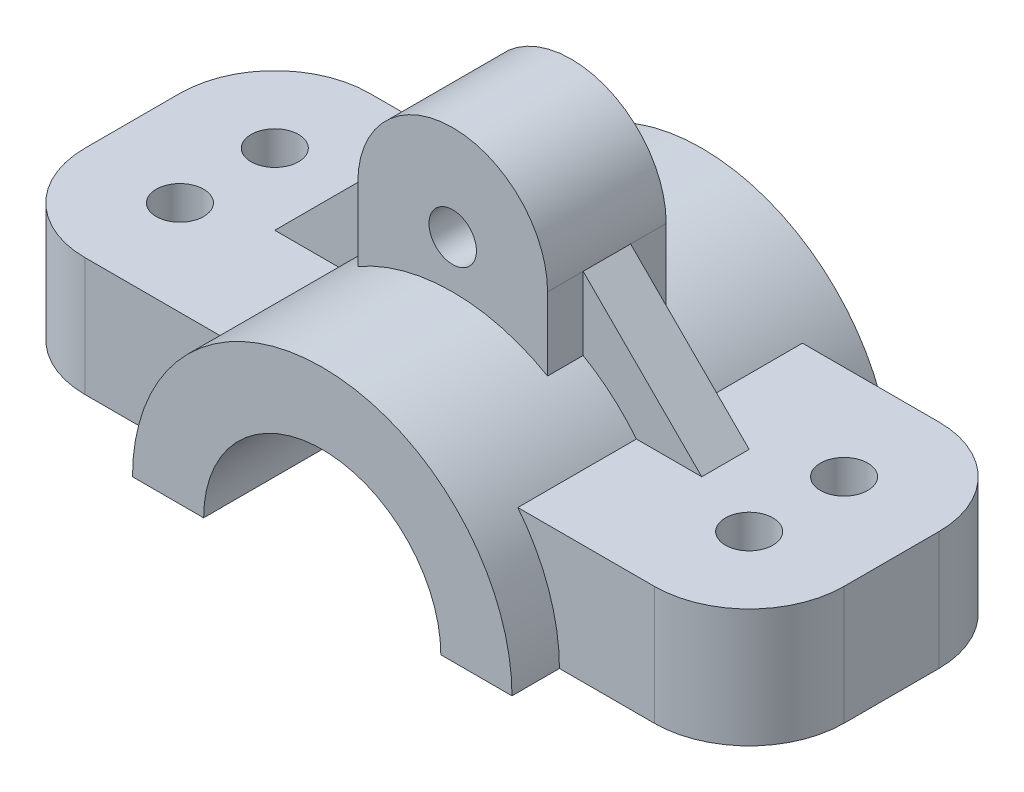
ISO-10303-21;
HEADER;
FILE_DESCRIPTION(('STEP AP214'),'2;1');
FILE_NAME('part.step','',(''),(''),'','','');
FILE_SCHEMA(('AUTOMOTIVE_DESIGN { 1 0 10303 214 1 1 1 1 }'));
ENDSEC;
DATA;
#1=APPLICATION_CONTEXT('core data for automotive mechanical design processes');
#2=APPLICATION_PROTOCOL_DEFINITION('international standard','automotive_design',2000,#1);
#3=PRODUCT_CONTEXT('',#1,'mechanical');
#4=PRODUCT('Part','Part','',(#3));
#5=PRODUCT_RELATED_PRODUCT_CATEGORY('part','',(#4));
#6=PRODUCT_DEFINITION_FORMATION('','',#4);
#7=PRODUCT_DEFINITION_CONTEXT('part definition',#1,'design');
#8=PRODUCT_DEFINITION('design','',#6,#7);
#9=PRODUCT_DEFINITION_SHAPE('','',#8);
#10=(LENGTH_UNIT() NAMED_UNIT(*) SI_UNIT(.MILLI.,.METRE.));
#11=(NAMED_UNIT(*) PLANE_ANGLE_UNIT() SI_UNIT($,.RADIAN.));
#12=(NAMED_UNIT(*) SI_UNIT($,.STERADIAN.) SOLID_ANGLE_UNIT());
#13=UNCERTAINTY_MEASURE_WITH_UNIT(LENGTH_MEASURE(1.E-05),#10,'distance_accuracy_value','');
#14=(GEOMETRIC_REPRESENTATION_CONTEXT(3) GLOBAL_UNCERTAINTY_ASSIGNED_CONTEXT((#13)) GLOBAL_UNIT_ASSIGNED_CONTEXT((#10,
#11,#12)) REPRESENTATION_CONTEXT('',''));
#15=CARTESIAN_POINT('',(0.,0.,0.));
#16=DIRECTION('',(0.,0.,1.));
#17=DIRECTION('',(1.,0.,0.));
#18=AXIS2_PLACEMENT_3D('',#15,#16,#17);
#19=CARTESIAN_POINT('',(0.,0.,40.));
#20=DIRECTION('',(0.,0.,-1.));
#21=DIRECTION('',(-1.,0.,0.));
#22=AXIS2_PLACEMENT_3D('',#19,#20,#21);
#23=CYLINDRICAL_SURFACE('',#22,40.);
#24=CARTESIAN_POINT('',(0.,0.,-5.));
#25=DIRECTION('',(0.,0.,1.));
#26=DIRECTION('',(1.,0.,0.));
#27=AXIS2_PLACEMENT_3D('',#24,#25,#26);
#28=CIRCLE('',#27,40.);
#29=CARTESIAN_POINT('',(31.224989991992,25.,-5.));
#30=VERTEX_POINT('',#29);
#31=CARTESIAN_POINT('',(20.,34.6410161513775,-5.));
#32=VERTEX_POINT('',#31);
#33=EDGE_CURVE('E253',#30,#32,#28,.T.);
#34=ORIENTED_EDGE('',*,*,#33,.F.);
#35=DIRECTION('',(0.,0.,-1.));
#36=VECTOR('',#35,1.);
#37=CARTESIAN_POINT('',(31.224989991992,25.,40.));
#38=LINE('',#37,#36);
#39=CARTESIAN_POINT('',(31.224989991992,25.,-30.));
#40=VERTEX_POINT('',#39);
#41=EDGE_CURVE('E520',#40,#30,#38,.F.);
#42=ORIENTED_EDGE('',*,*,#41,.F.);
#43=CARTESIAN_POINT('',(0.,0.,-30.));
#44=DIRECTION('',(0.,0.,1.));
#45=DIRECTION('',(1.,0.,0.));
#46=AXIS2_PLACEMENT_3D('',#43,#44,#45);
#47=CIRCLE('',#46,40.);
#48=CARTESIAN_POINT('',(40.,0.,-30.));
#49=VERTEX_POINT('',#48);
#50=EDGE_CURVE('E527',#49,#40,#47,.T.);
#51=ORIENTED_EDGE('',*,*,#50,.F.);
#52=DIRECTION('',(0.,0.,-1.));
#53=VECTOR('',#52,1.);
#54=CARTESIAN_POINT('',(40.,0.,40.));
#55=LINE('',#54,#53);
#56=CARTESIAN_POINT('',(40.,0.,-40.));
#57=VERTEX_POINT('',#56);
#58=EDGE_CURVE('E480',#49,#57,#55,.T.);
#59=ORIENTED_EDGE('',*,*,#58,.T.);
#60=CARTESIAN_POINT('',(0.,0.,-40.));
#61=DIRECTION('',(0.,0.,1.));
#62=DIRECTION('',(1.,0.,0.));
#63=AXIS2_PLACEMENT_3D('',#60,#61,#62);
#64=CIRCLE('',#63,40.);
#65=CARTESIAN_POINT('',(-40.,0.,-40.));
#66=VERTEX_POINT('',#65);
#67=EDGE_CURVE('E466',#57,#66,#64,.T.);
#68=ORIENTED_EDGE('',*,*,#67,.T.);
#69=DIRECTION('',(0.,0.,-1.));
#70=VECTOR('',#69,1.);
#71=CARTESIAN_POINT('',(-40.,0.,40.));
#72=LINE('',#71,#70);
#73=CARTESIAN_POINT('',(-40.,0.,-30.));
#74=VERTEX_POINT('',#73);
#75=EDGE_CURVE('E475',#74,#66,#72,.T.);
#76=ORIENTED_EDGE('',*,*,#75,.F.);
#77=CARTESIAN_POINT('',(0.,0.,-30.));
#78=DIRECTION('',(0.,0.,-1.));
#79=DIRECTION('',(-1.,0.,0.));
#80=AXIS2_PLACEMENT_3D('',#77,#78,#79);
#81=CIRCLE('',#80,40.);
#82=CARTESIAN_POINT('',(-31.224989991992,25.,-30.));
#83=VERTEX_POINT('',#82);
#84=EDGE_CURVE('E427',#74,#83,#81,.T.);
#85=ORIENTED_EDGE('',*,*,#84,.T.);
#86=DIRECTION('',(0.,0.,-1.));
#87=VECTOR('',#86,1.);
#88=CARTESIAN_POINT('',(-31.224989991992,25.,40.));
#89=LINE('',#88,#87);
#90=CARTESIAN_POINT('',(-31.224989991992,25.,-5.));
#91=VERTEX_POINT('',#90);
#92=EDGE_CURVE('E487',#91,#83,#89,.T.);
#93=ORIENTED_EDGE('',*,*,#92,.F.);
#94=CARTESIAN_POINT('',(0.,0.,-5.));
#95=DIRECTION('',(0.,0.,1.));
#96=DIRECTION('',(1.,0.,0.));
#97=AXIS2_PLACEMENT_3D('',#94,#95,#96);
#98=CIRCLE('',#97,40.);
#99=CARTESIAN_POINT('',(-20.,34.6410161513775,-5.));
#100=VERTEX_POINT('',#99);
#101=EDGE_CURVE('E287',#100,#91,#98,.T.);
#102=ORIENTED_EDGE('',*,*,#101,.F.);
#103=DIRECTION('',(0.,0.,-1.));
#104=VECTOR('',#103,1.);
#105=CARTESIAN_POINT('',(-20.,34.6410161513775,12.5015));
#106=LINE('',#105,#104);
#107=CARTESIAN_POINT('',(-20.,34.6410161513775,-12.5015));
#108=VERTEX_POINT('',#107);
#109=EDGE_CURVE('E351',#100,#108,#106,.T.);
#110=ORIENTED_EDGE('',*,*,#109,.T.);
#111=CARTESIAN_POINT('',(0.,0.,-12.5015));
#112=DIRECTION('',(0.,0.,-1.));
#113=DIRECTION('',(1.,0.,0.));
#114=AXIS2_PLACEMENT_3D('',#111,#112,#113);
#115=CIRCLE('',#114,40.);
#116=CARTESIAN_POINT('',(20.,34.6410161513775,-12.5015));
#117=VERTEX_POINT('',#116);
#118=EDGE_CURVE('E339',#108,#117,#115,.T.);
#119=ORIENTED_EDGE('',*,*,#118,.T.);
#120=DIRECTION('',(0.,0.,-1.));
#121=VECTOR('',#120,1.);
#122=CARTESIAN_POINT('',(20.,34.6410161513775,12.5015));
#123=LINE('',#122,#121);
#124=EDGE_CURVE('E346',#32,#117,#123,.T.);
#125=ORIENTED_EDGE('',*,*,#124,.F.);
#126=EDGE_LOOP('',(#34,#42,#51,#59,#68,#76,#85,#93,#102,#110,#119,#125));
#127=FACE_BOUND('',#126,.T.);
#128=ADVANCED_FACE('F39',(#127),#23,.T.);
#129=CARTESIAN_POINT('',(20.,50.,12.5015));
#130=DIRECTION('',(-1.,0.,0.));
#131=DIRECTION('',(0.,0.,1.));
#132=AXIS2_PLACEMENT_3D('',#129,#130,#131);
#133=PLANE('',#132);
#134=DIRECTION('',(0.,1.,0.));
#135=VECTOR('',#134,1.);
#136=CARTESIAN_POINT('',(20.,50.,-5.));
#137=LINE('',#136,#135);
#138=CARTESIAN_POINT('',(20.,49.9999999999999,-5.));
#139=VERTEX_POINT('',#138);
#140=EDGE_CURVE('E241',#32,#139,#137,.T.);
#141=ORIENTED_EDGE('',*,*,#140,.F.);
#142=ORIENTED_EDGE('',*,*,#124,.T.);
#143=DIRECTION('',(0.,1.,0.));
#144=VECTOR('',#143,1.);
#145=CARTESIAN_POINT('',(20.,50.,-12.5015));
#146=LINE('',#145,#144);
#147=CARTESIAN_POINT('',(20.,50.,-12.5015));
#148=VERTEX_POINT('',#147);
#149=EDGE_CURVE('E244',#117,#148,#146,.T.);
#150=ORIENTED_EDGE('',*,*,#149,.T.);
#151=DIRECTION('',(0.,0.,-1.));
#152=VECTOR('',#151,1.);
#153=CARTESIAN_POINT('',(20.,50.,12.5015));
#154=LINE('',#153,#152);
#155=EDGE_CURVE('E227',#139,#148,#154,.T.);
#156=ORIENTED_EDGE('',*,*,#155,.F.);
#157=EDGE_LOOP('',(#141,#142,#150,#156));
#158=FACE_BOUND('',#157,.T.);
#159=ADVANCED_FACE('F240',(#158),#133,.F.);
#160=CARTESIAN_POINT('',(-20.,50.,12.5015));
#161=DIRECTION('',(1.,0.,0.));
#162=DIRECTION('',(0.,0.,-1.));
#163=AXIS2_PLACEMENT_3D('',#160,#161,#162);
#164=PLANE('',#163);
#165=DIRECTION('',(0.,-1.,0.));
#166=VECTOR('',#165,1.);
#167=CARTESIAN_POINT('',(-20.,50.,-5.));
#168=LINE('',#167,#166);
#169=CARTESIAN_POINT('',(-20.,50.,-5.));
#170=VERTEX_POINT('',#169);
#171=EDGE_CURVE('E283',#170,#100,#168,.T.);
#172=ORIENTED_EDGE('',*,*,#171,.F.);
#173=DIRECTION('',(0.,0.,-1.));
#174=VECTOR('',#173,1.);
#175=CARTESIAN_POINT('',(-20.,50.,12.5015));
#176=LINE('',#175,#174);
#177=CARTESIAN_POINT('',(-20.,50.,-12.5015));
#178=VERTEX_POINT('',#177);
#179=EDGE_CURVE('E356',#170,#178,#176,.T.);
#180=ORIENTED_EDGE('',*,*,#179,.T.);
#181=DIRECTION('',(0.,-1.,0.));
#182=VECTOR('',#181,1.);
#183=CARTESIAN_POINT('',(-20.,50.,-12.5015));
#184=LINE('',#183,#182);
#185=EDGE_CURVE('E335',#178,#108,#184,.T.);
#186=ORIENTED_EDGE('',*,*,#185,.T.);
#187=ORIENTED_EDGE('',*,*,#109,.F.);
#188=EDGE_LOOP('',(#172,#180,#186,#187));
#189=FACE_BOUND('',#188,.T.);
#190=ADVANCED_FACE('F620',(#189),#164,.F.);
#191=CARTESIAN_POINT('',(31.224989991992,25.,5.));
#192=VERTEX_POINT('',#191);
#193=CARTESIAN_POINT('',(31.224989991992,25.,30.));
#194=VERTEX_POINT('',#193);
#195=EDGE_CURVE('E519',#192,#194,#38,.F.);
#196=ORIENTED_EDGE('',*,*,#195,.F.);
#197=CARTESIAN_POINT('',(0.,0.,5.));
#198=DIRECTION('',(0.,0.,1.));
#199=DIRECTION('',(1.,0.,0.));
#200=AXIS2_PLACEMENT_3D('',#197,#198,#199);
#201=CIRCLE('',#200,40.);
#202=CARTESIAN_POINT('',(20.,34.6410161513775,5.));
#203=VERTEX_POINT('',#202);
#204=EDGE_CURVE('E270',#192,#203,#201,.T.);
#205=ORIENTED_EDGE('',*,*,#204,.T.);
#206=CARTESIAN_POINT('',(20.,34.6410161513775,12.5015));
#207=VERTEX_POINT('',#206);
#208=EDGE_CURVE('E347',#207,#203,#123,.T.);
#209=ORIENTED_EDGE('',*,*,#208,.F.);
#210=CARTESIAN_POINT('',(0.,0.,12.5015));
#211=DIRECTION('',(0.,0.,-1.));
#212=DIRECTION('',(1.,0.,0.));
#213=AXIS2_PLACEMENT_3D('',#210,#211,#212);
#214=CIRCLE('',#213,40.);
#215=CARTESIAN_POINT('',(-20.,34.6410161513775,12.5015));
#216=VERTEX_POINT('',#215);
#217=EDGE_CURVE('E327',#216,#207,#214,.T.);
#218=ORIENTED_EDGE('',*,*,#217,.F.);
#219=CARTESIAN_POINT('',(-20.,34.6410161513775,5.));
#220=VERTEX_POINT('',#219);
#221=EDGE_CURVE('E352',#216,#220,#106,.T.);
#222=ORIENTED_EDGE('',*,*,#221,.T.);
#223=CARTESIAN_POINT('',(0.,0.,5.));
#224=DIRECTION('',(0.,0.,1.));
#225=DIRECTION('',(1.,0.,0.));
#226=AXIS2_PLACEMENT_3D('',#223,#224,#225);
#227=CIRCLE('',#226,40.);
#228=CARTESIAN_POINT('',(-31.224989991992,25.,5.));
#229=VERTEX_POINT('',#228);
#230=EDGE_CURVE('E299',#220,#229,#227,.T.);
#231=ORIENTED_EDGE('',*,*,#230,.T.);
#232=CARTESIAN_POINT('',(-31.224989991992,25.,30.));
#233=VERTEX_POINT('',#232);
#234=EDGE_CURVE('E488',#233,#229,#89,.T.);
#235=ORIENTED_EDGE('',*,*,#234,.F.);
#236=CARTESIAN_POINT('',(0.,0.,30.));
#237=DIRECTION('',(0.,0.,1.));
#238=DIRECTION('',(1.,0.,0.));
#239=AXIS2_PLACEMENT_3D('',#236,#237,#238);
#240=CIRCLE('',#239,40.);
#241=CARTESIAN_POINT('',(-40.,0.,30.));
#242=VERTEX_POINT('',#241);
#243=EDGE_CURVE('E439',#233,#242,#240,.T.);
#244=ORIENTED_EDGE('',*,*,#243,.T.);
#245=CARTESIAN_POINT('',(-40.,0.,40.));
#246=VERTEX_POINT('',#245);
#247=EDGE_CURVE('E476',#246,#242,#72,.T.);
#248=ORIENTED_EDGE('',*,*,#247,.F.);
#249=CARTESIAN_POINT('',(0.,0.,40.));
#250=DIRECTION('',(0.,0.,1.));
#251=DIRECTION('',(1.,0.,0.));
#252=AXIS2_PLACEMENT_3D('',#249,#250,#251);
#253=CIRCLE('',#252,40.);
#254=CARTESIAN_POINT('',(40.,0.,40.));
#255=VERTEX_POINT('',#254);
#256=EDGE_CURVE('E452',#255,#246,#253,.T.);
#257=ORIENTED_EDGE('',*,*,#256,.F.);
#258=CARTESIAN_POINT('',(40.,0.,30.));
#259=VERTEX_POINT('',#258);
#260=EDGE_CURVE('E481',#255,#259,#55,.T.);
#261=ORIENTED_EDGE('',*,*,#260,.T.);
#262=CARTESIAN_POINT('',(0.,0.,30.));
#263=DIRECTION('',(0.,0.,-1.));
#264=DIRECTION('',(-1.,0.,0.));
#265=AXIS2_PLACEMENT_3D('',#262,#263,#264);
#266=CIRCLE('',#265,40.);
#267=EDGE_CURVE('E523',#194,#259,#266,.T.);
#268=ORIENTED_EDGE('',*,*,#267,.F.);
#269=EDGE_LOOP('',(#196,#205,#209,#218,#222,#231,#235,#244,#248,#257,#261,#268));
#270=FACE_BOUND('',#269,.T.);
#271=ADVANCED_FACE('F590',(#270),#23,.T.);
#272=CARTESIAN_POINT('',(0.,0.,40.));
#273=DIRECTION('',(0.,0.,-1.));
#274=DIRECTION('',(-1.,0.,0.));
#275=AXIS2_PLACEMENT_3D('',#272,#273,#274);
#276=CYLINDRICAL_SURFACE('',#275,25.);
#277=DIRECTION('',(0.,0.,-1.));
#278=VECTOR('',#277,1.);
#279=CARTESIAN_POINT('',(-25.,0.,40.));
#280=LINE('',#279,#278);
#281=CARTESIAN_POINT('',(-25.,0.,40.));
#282=VERTEX_POINT('',#281);
#283=CARTESIAN_POINT('',(-25.,0.,-40.));
#284=VERTEX_POINT('',#283);
#285=EDGE_CURVE('E458',#282,#284,#280,.T.);
#286=ORIENTED_EDGE('',*,*,#285,.T.);
#287=CARTESIAN_POINT('',(0.,0.,-40.));
#288=DIRECTION('',(0.,0.,-1.));
#289=DIRECTION('',(1.,0.,0.));
#290=AXIS2_PLACEMENT_3D('',#287,#288,#289);
#291=CIRCLE('',#290,25.);
#292=CARTESIAN_POINT('',(25.,0.,-40.));
#293=VERTEX_POINT('',#292);
#294=EDGE_CURVE('E443',#284,#293,#291,.T.);
#295=ORIENTED_EDGE('',*,*,#294,.T.);
#296=DIRECTION('',(0.,0.,-1.));
#297=VECTOR('',#296,1.);
#298=CARTESIAN_POINT('',(25.,0.,40.));
#299=LINE('',#298,#297);
#300=CARTESIAN_POINT('',(25.,0.,40.));
#301=VERTEX_POINT('',#300);
#302=EDGE_CURVE('E484',#301,#293,#299,.T.);
#303=ORIENTED_EDGE('',*,*,#302,.F.);
#304=CARTESIAN_POINT('',(0.,0.,40.));
#305=DIRECTION('',(0.,0.,-1.));
#306=DIRECTION('',(1.,0.,0.));
#307=AXIS2_PLACEMENT_3D('',#304,#305,#306);
#308=CIRCLE('',#307,25.);
#309=EDGE_CURVE('E444',#282,#301,#308,.T.);
#310=ORIENTED_EDGE('',*,*,#309,.F.);
#311=EDGE_LOOP('',(#286,#295,#303,#310));
#312=FACE_BOUND('',#311,.T.);
#313=ADVANCED_FACE('F626',(#312),#276,.F.);
#314=CARTESIAN_POINT('',(25.,0.,40.));
#315=DIRECTION('',(0.,1.,0.));
#316=DIRECTION('',(0.,0.,1.));
#317=AXIS2_PLACEMENT_3D('',#314,#315,#316);
#318=PLANE('',#317);
#319=CARTESIAN_POINT('',(60.,0.,9.99999999999999));
#320=DIRECTION('',(0.,1.,0.));
#321=DIRECTION('',(0.,0.,1.));
#322=AXIS2_PLACEMENT_3D('',#319,#320,#321);
#323=CIRCLE('',#322,4.99999999999999);
#324=CARTESIAN_POINT('',(60.,0.,15.));
#325=VERTEX_POINT('',#324);
#326=EDGE_CURVE('E366',#325,#325,#323,.T.);
#327=ORIENTED_EDGE('',*,*,#326,.T.);
#328=EDGE_LOOP('',(#327));
#329=FACE_BOUND('',#328,.T.);
#330=CARTESIAN_POINT('',(60.,0.,-10.));
#331=DIRECTION('',(0.,1.,0.));
#332=DIRECTION('',(0.,0.,1.));
#333=AXIS2_PLACEMENT_3D('',#330,#331,#332);
#334=CIRCLE('',#333,5.);
#335=CARTESIAN_POINT('',(60.,0.,-5.00000000000001));
#336=VERTEX_POINT('',#335);
#337=EDGE_CURVE('E374',#336,#336,#334,.T.);
#338=ORIENTED_EDGE('',*,*,#337,.T.);
#339=EDGE_LOOP('',(#338));
#340=FACE_BOUND('',#339,.T.);
#341=ORIENTED_EDGE('',*,*,#302,.T.);
#342=DIRECTION('',(1.,0.,0.));
#343=VECTOR('',#342,1.);
#344=CARTESIAN_POINT('',(25.,0.,-40.));
#345=LINE('',#344,#343);
#346=EDGE_CURVE('E462',#293,#57,#345,.T.);
#347=ORIENTED_EDGE('',*,*,#346,.T.);
#348=ORIENTED_EDGE('',*,*,#58,.F.);
#349=DIRECTION('',(-1.,0.,0.));
#350=VECTOR('',#349,1.);
#351=CARTESIAN_POINT('',(80.,0.,-30.));
#352=LINE('',#351,#350);
#353=CARTESIAN_POINT('',(60.,0.,-30.));
#354=VERTEX_POINT('',#353);
#355=EDGE_CURVE('E383',#354,#49,#352,.T.);
#356=ORIENTED_EDGE('',*,*,#355,.F.);
#357=CARTESIAN_POINT('',(60.,0.,-10.));
#358=DIRECTION('',(0.,1.,0.));
#359=DIRECTION('',(0.,0.,1.));
#360=AXIS2_PLACEMENT_3D('',#357,#358,#359);
#361=CIRCLE('',#360,20.);
#362=CARTESIAN_POINT('',(80.,0.,-10.));
#363=VERTEX_POINT('',#362);
#364=EDGE_CURVE('E538',#354,#363,#361,.F.);
#365=ORIENTED_EDGE('',*,*,#364,.T.);
#366=DIRECTION('',(0.,0.,-1.));
#367=VECTOR('',#366,1.);
#368=CARTESIAN_POINT('',(80.,0.,30.));
#369=LINE('',#368,#367);
#370=CARTESIAN_POINT('',(80.,0.,9.99999999999999));
#371=VERTEX_POINT('',#370);
#372=EDGE_CURVE('E378',#371,#363,#369,.T.);
#373=ORIENTED_EDGE('',*,*,#372,.F.);
#374=CARTESIAN_POINT('',(60.,0.,9.99999999999999));
#375=DIRECTION('',(0.,1.,0.));
#376=DIRECTION('',(0.,0.,1.));
#377=AXIS2_PLACEMENT_3D('',#374,#375,#376);
#378=CIRCLE('',#377,20.);
#379=CARTESIAN_POINT('',(60.,0.,30.));
#380=VERTEX_POINT('',#379);
#381=EDGE_CURVE('E535',#371,#380,#378,.F.);
#382=ORIENTED_EDGE('',*,*,#381,.T.);
#383=DIRECTION('',(1.,0.,0.));
#384=VECTOR('',#383,1.);
#385=CARTESIAN_POINT('',(80.,0.,30.));
#386=LINE('',#385,#384);
#387=EDGE_CURVE('E393',#259,#380,#386,.T.);
#388=ORIENTED_EDGE('',*,*,#387,.F.);
#389=ORIENTED_EDGE('',*,*,#260,.F.);
#390=DIRECTION('',(1.,0.,0.));
#391=VECTOR('',#390,1.);
#392=CARTESIAN_POINT('',(25.,0.,40.));
#393=LINE('',#392,#391);
#394=EDGE_CURVE('E448',#301,#255,#393,.T.);
#395=ORIENTED_EDGE('',*,*,#394,.F.);
#396=EDGE_LOOP('',(#341,#347,#348,#356,#365,#373,#382,#388,#389,#395));
#397=FACE_BOUND('',#396,.T.);
#398=ADVANCED_FACE('F569',(#329,#340,#397),#318,.F.);
#399=CARTESIAN_POINT('',(-40.,0.,40.));
#400=DIRECTION('',(0.,1.,0.));
#401=DIRECTION('',(0.,0.,1.));
#402=AXIS2_PLACEMENT_3D('',#399,#400,#401);
#403=PLANE('',#402);
#404=CARTESIAN_POINT('',(-60.,0.,9.99999999999999));
#405=DIRECTION('',(0.,1.,0.));
#406=DIRECTION('',(0.,0.,1.));
#407=AXIS2_PLACEMENT_3D('',#404,#405,#406);
#408=CIRCLE('',#407,4.99999999999999);
#409=CARTESIAN_POINT('',(-60.,0.,15.));
#410=VERTEX_POINT('',#409);
#411=EDGE_CURVE('E402',#410,#410,#408,.T.);
#412=ORIENTED_EDGE('',*,*,#411,.T.);
#413=EDGE_LOOP('',(#412));
#414=FACE_BOUND('',#413,.T.);
#415=DIRECTION('',(0.,0.,-1.));
#416=VECTOR('',#415,1.);
#417=CARTESIAN_POINT('',(-80.,0.,30.));
#418=LINE('',#417,#416);
#419=CARTESIAN_POINT('',(-80.,0.,9.99999999999999));
#420=VERTEX_POINT('',#419);
#421=CARTESIAN_POINT('',(-80.,0.,-10.));
#422=VERTEX_POINT('',#421);
#423=EDGE_CURVE('E414',#420,#422,#418,.T.);
#424=ORIENTED_EDGE('',*,*,#423,.T.);
#425=CARTESIAN_POINT('',(-60.,0.,-10.));
#426=DIRECTION('',(0.,1.,0.));
#427=DIRECTION('',(0.,0.,1.));
#428=AXIS2_PLACEMENT_3D('',#425,#426,#427);
#429=CIRCLE('',#428,20.);
#430=CARTESIAN_POINT('',(-60.,0.,-30.));
#431=VERTEX_POINT('',#430);
#432=EDGE_CURVE('E502',#422,#431,#429,.F.);
#433=ORIENTED_EDGE('',*,*,#432,.T.);
#434=DIRECTION('',(1.,0.,0.));
#435=VECTOR('',#434,1.);
#436=CARTESIAN_POINT('',(-80.,0.,-30.));
#437=LINE('',#436,#435);
#438=EDGE_CURVE('E430',#431,#74,#437,.T.);
#439=ORIENTED_EDGE('',*,*,#438,.T.);
#440=ORIENTED_EDGE('',*,*,#75,.T.);
#441=DIRECTION('',(1.,0.,0.));
#442=VECTOR('',#441,1.);
#443=CARTESIAN_POINT('',(-40.,0.,-40.));
#444=LINE('',#443,#442);
#445=EDGE_CURVE('E449',#66,#284,#444,.T.);
#446=ORIENTED_EDGE('',*,*,#445,.T.);
#447=ORIENTED_EDGE('',*,*,#285,.F.);
#448=DIRECTION('',(1.,0.,0.));
#449=VECTOR('',#448,1.);
#450=CARTESIAN_POINT('',(-40.,0.,40.));
#451=LINE('',#450,#449);
#452=EDGE_CURVE('E455',#246,#282,#451,.T.);
#453=ORIENTED_EDGE('',*,*,#452,.F.);
#454=ORIENTED_EDGE('',*,*,#247,.T.);
#455=DIRECTION('',(-1.,0.,0.));
#456=VECTOR('',#455,1.);
#457=CARTESIAN_POINT('',(-80.,0.,30.));
#458=LINE('',#457,#456);
#459=CARTESIAN_POINT('',(-60.,0.,30.));
#460=VERTEX_POINT('',#459);
#461=EDGE_CURVE('E419',#242,#460,#458,.T.);
#462=ORIENTED_EDGE('',*,*,#461,.T.);
#463=CARTESIAN_POINT('',(-60.,0.,9.99999999999999));
#464=DIRECTION('',(0.,1.,0.));
#465=DIRECTION('',(0.,0.,1.));
#466=AXIS2_PLACEMENT_3D('',#463,#464,#465);
#467=CIRCLE('',#466,20.);
#468=EDGE_CURVE('E499',#460,#420,#467,.F.);
#469=ORIENTED_EDGE('',*,*,#468,.T.);
#470=EDGE_LOOP('',(#424,#433,#439,#440,#446,#447,#453,#454,#462,#469));
#471=FACE_BOUND('',#470,.T.);
#472=CARTESIAN_POINT('',(-60.,0.,-10.));
#473=DIRECTION('',(0.,1.,0.));
#474=DIRECTION('',(0.,0.,1.));
#475=AXIS2_PLACEMENT_3D('',#472,#473,#474);
#476=CIRCLE('',#475,4.99999999999999);
#477=CARTESIAN_POINT('',(-60.,0.,-5.00000000000002));
#478=VERTEX_POINT('',#477);
#479=EDGE_CURVE('E410',#478,#478,#476,.T.);
#480=ORIENTED_EDGE('',*,*,#479,.T.);
#481=EDGE_LOOP('',(#480));
#482=FACE_BOUND('',#481,.T.);
#483=ADVANCED_FACE('F690',(#414,#471,#482),#403,.F.);
#484=CARTESIAN_POINT('',(0.,0.,40.));
#485=DIRECTION('',(0.,0.,1.));
#486=DIRECTION('',(1.,0.,0.));
#487=AXIS2_PLACEMENT_3D('',#484,#485,#486);
#488=PLANE('',#487);
#489=ORIENTED_EDGE('',*,*,#309,.T.);
#490=ORIENTED_EDGE('',*,*,#394,.T.);
#491=ORIENTED_EDGE('',*,*,#256,.T.);
#492=ORIENTED_EDGE('',*,*,#452,.T.);
#493=EDGE_LOOP('',(#489,#490,#491,#492));
#494=FACE_BOUND('',#493,.T.);
#495=ADVANCED_FACE('F866',(#494),#488,.T.);
#496=CARTESIAN_POINT('',(0.,0.,-40.));
#497=DIRECTION('',(0.,0.,1.));
#498=DIRECTION('',(1.,0.,0.));
#499=AXIS2_PLACEMENT_3D('',#496,#497,#498);
#500=PLANE('',#499);
#501=ORIENTED_EDGE('',*,*,#294,.F.);
#502=ORIENTED_EDGE('',*,*,#445,.F.);
#503=ORIENTED_EDGE('',*,*,#67,.F.);
#504=ORIENTED_EDGE('',*,*,#346,.F.);
#505=EDGE_LOOP('',(#501,#502,#503,#504));
#506=FACE_BOUND('',#505,.T.);
#507=ADVANCED_FACE('F857',(#506),#500,.F.);
#508=CARTESIAN_POINT('',(-80.,25.,30.));
#509=DIRECTION('',(-1.,0.,0.));
#510=DIRECTION('',(0.,0.,1.));
#511=AXIS2_PLACEMENT_3D('',#508,#509,#510);
#512=PLANE('',#511);
#513=DIRECTION('',(0.,0.,-1.));
#514=VECTOR('',#513,1.);
#515=CARTESIAN_POINT('',(-80.,25.,30.));
#516=LINE('',#515,#514);
#517=CARTESIAN_POINT('',(-80.,25.,9.99999999999999));
#518=VERTEX_POINT('',#517);
#519=CARTESIAN_POINT('',(-80.,25.,-10.));
#520=VERTEX_POINT('',#519);
#521=EDGE_CURVE('E415',#518,#520,#516,.T.);
#522=ORIENTED_EDGE('',*,*,#521,.T.);
#523=DIRECTION('',(0.,-1.,0.));
#524=VECTOR('',#523,1.);
#525=CARTESIAN_POINT('',(-80.,25.,-10.));
#526=LINE('',#525,#524);
#527=EDGE_CURVE('E495',#520,#422,#526,.T.);
#528=ORIENTED_EDGE('',*,*,#527,.T.);
#529=ORIENTED_EDGE('',*,*,#423,.F.);
#530=DIRECTION('',(0.,-1.,0.));
#531=VECTOR('',#530,1.);
#532=CARTESIAN_POINT('',(-80.,25.,9.99999999999999));
#533=LINE('',#532,#531);
#534=EDGE_CURVE('E492',#420,#518,#533,.F.);
#535=ORIENTED_EDGE('',*,*,#534,.T.);
#536=EDGE_LOOP('',(#522,#528,#529,#535));
#537=FACE_BOUND('',#536,.T.);
#538=ADVANCED_FACE('F853',(#537),#512,.T.);
#539=CARTESIAN_POINT('',(-80.,25.,-30.));
#540=DIRECTION('',(0.,0.,-1.));
#541=DIRECTION('',(-1.,0.,0.));
#542=AXIS2_PLACEMENT_3D('',#539,#540,#541);
#543=PLANE('',#542);
#544=ORIENTED_EDGE('',*,*,#438,.F.);
#545=DIRECTION('',(0.,-1.,0.));
#546=VECTOR('',#545,1.);
#547=CARTESIAN_POINT('',(-60.,25.,-30.));
#548=LINE('',#547,#546);
#549=CARTESIAN_POINT('',(-60.,25.,-30.));
#550=VERTEX_POINT('',#549);
#551=EDGE_CURVE('E505',#431,#550,#548,.F.);
#552=ORIENTED_EDGE('',*,*,#551,.T.);
#553=DIRECTION('',(1.,0.,0.));
#554=VECTOR('',#553,1.);
#555=CARTESIAN_POINT('',(-80.,25.,-30.));
#556=LINE('',#555,#554);
#557=EDGE_CURVE('E418',#550,#83,#556,.T.);
#558=ORIENTED_EDGE('',*,*,#557,.T.);
#559=ORIENTED_EDGE('',*,*,#84,.F.);
#560=EDGE_LOOP('',(#544,#552,#558,#559));
#561=FACE_BOUND('',#560,.T.);
#562=ADVANCED_FACE('F673',(#561),#543,.T.);
#563=CARTESIAN_POINT('',(-80.,25.,30.));
#564=DIRECTION('',(0.,0.,1.));
#565=DIRECTION('',(1.,0.,0.));
#566=AXIS2_PLACEMENT_3D('',#563,#564,#565);
#567=PLANE('',#566);
#568=DIRECTION('',(-1.,0.,0.));
#569=VECTOR('',#568,1.);
#570=CARTESIAN_POINT('',(-80.,25.,30.));
#571=LINE('',#570,#569);
#572=CARTESIAN_POINT('',(-60.,25.,30.));
#573=VERTEX_POINT('',#572);
#574=EDGE_CURVE('E423',#233,#573,#571,.T.);
#575=ORIENTED_EDGE('',*,*,#574,.T.);
#576=DIRECTION('',(0.,-1.,0.));
#577=VECTOR('',#576,1.);
#578=CARTESIAN_POINT('',(-60.,25.,30.));
#579=LINE('',#578,#577);
#580=EDGE_CURVE('E515',#573,#460,#579,.T.);
#581=ORIENTED_EDGE('',*,*,#580,.T.);
#582=ORIENTED_EDGE('',*,*,#461,.F.);
#583=ORIENTED_EDGE('',*,*,#243,.F.);
#584=EDGE_LOOP('',(#575,#581,#582,#583));
#585=FACE_BOUND('',#584,.T.);
#586=ADVANCED_FACE('F688',(#585),#567,.T.);
#587=CARTESIAN_POINT('',(0.,25.,0.));
#588=DIRECTION('',(0.,-1.,0.));
#589=DIRECTION('',(0.,0.,-1.));
#590=AXIS2_PLACEMENT_3D('',#587,#588,#589);
#591=PLANE('',#590);
#592=CARTESIAN_POINT('',(-60.,25.,9.99999999999999));
#593=DIRECTION('',(0.,1.,0.));
#594=DIRECTION('',(0.,0.,1.));
#595=AXIS2_PLACEMENT_3D('',#592,#593,#594);
#596=CIRCLE('',#595,5.);
#597=CARTESIAN_POINT('',(-60.,25.,15.));
#598=VERTEX_POINT('',#597);
#599=EDGE_CURVE('E390',#598,#598,#596,.T.);
#600=ORIENTED_EDGE('',*,*,#599,.F.);
#601=EDGE_LOOP('',(#600));
#602=FACE_BOUND('',#601,.T.);
#603=DIRECTION('',(-1.,0.,0.));
#604=VECTOR('',#603,1.);
#605=CARTESIAN_POINT('',(0.,25.,5.));
#606=LINE('',#605,#604);
#607=CARTESIAN_POINT('',(-45.,25.,5.));
#608=VERTEX_POINT('',#607);
#609=EDGE_CURVE('E302',#229,#608,#606,.T.);
#610=ORIENTED_EDGE('',*,*,#609,.T.);
#611=DIRECTION('',(0.,0.,1.));
#612=VECTOR('',#611,1.);
#613=CARTESIAN_POINT('',(-45.,25.,0.));
#614=LINE('',#613,#612);
#615=CARTESIAN_POINT('',(-45.,25.,-5.));
#616=VERTEX_POINT('',#615);
#617=EDGE_CURVE('E307',#608,#616,#614,.F.);
#618=ORIENTED_EDGE('',*,*,#617,.T.);
#619=DIRECTION('',(-1.,0.,0.));
#620=VECTOR('',#619,1.);
#621=CARTESIAN_POINT('',(0.,25.,-5.));
#622=LINE('',#621,#620);
#623=EDGE_CURVE('E291',#91,#616,#622,.T.);
#624=ORIENTED_EDGE('',*,*,#623,.F.);
#625=ORIENTED_EDGE('',*,*,#92,.T.);
#626=ORIENTED_EDGE('',*,*,#557,.F.);
#627=CARTESIAN_POINT('',(-60.,25.,-10.));
#628=DIRECTION('',(0.,-1.,0.));
#629=DIRECTION('',(0.,0.,-1.));
#630=AXIS2_PLACEMENT_3D('',#627,#628,#629);
#631=CIRCLE('',#630,20.);
#632=EDGE_CURVE('E511',#550,#520,#631,.F.);
#633=ORIENTED_EDGE('',*,*,#632,.T.);
#634=ORIENTED_EDGE('',*,*,#521,.F.);
#635=CARTESIAN_POINT('',(-60.,25.,9.99999999999999));
#636=DIRECTION('',(0.,-1.,0.));
#637=DIRECTION('',(0.,0.,-1.));
#638=AXIS2_PLACEMENT_3D('',#635,#636,#637);
#639=CIRCLE('',#638,20.);
#640=EDGE_CURVE('E508',#518,#573,#639,.F.);
#641=ORIENTED_EDGE('',*,*,#640,.T.);
#642=ORIENTED_EDGE('',*,*,#574,.F.);
#643=ORIENTED_EDGE('',*,*,#234,.T.);
#644=EDGE_LOOP('',(#610,#618,#624,#625,#626,#633,#634,#641,#642,#643));
#645=FACE_BOUND('',#644,.T.);
#646=CARTESIAN_POINT('',(-60.,25.,-10.));
#647=DIRECTION('',(0.,1.,0.));
#648=DIRECTION('',(0.,0.,1.));
#649=AXIS2_PLACEMENT_3D('',#646,#647,#648);
#650=CIRCLE('',#649,5.);
#651=CARTESIAN_POINT('',(-60.,25.,-5.00000000000001));
#652=VERTEX_POINT('',#651);
#653=EDGE_CURVE('E406',#652,#652,#650,.T.);
#654=ORIENTED_EDGE('',*,*,#653,.F.);
#655=EDGE_LOOP('',(#654));
#656=FACE_BOUND('',#655,.T.);
#657=ADVANCED_FACE('F661',(#602,#645,#656),#591,.F.);
#658=CARTESIAN_POINT('',(-60.,25.,-10.));
#659=DIRECTION('',(0.,-1.,0.));
#660=DIRECTION('',(0.,0.,-1.));
#661=AXIS2_PLACEMENT_3D('',#658,#659,#660);
#662=CYLINDRICAL_SURFACE('',#661,20.);
#663=ORIENTED_EDGE('',*,*,#632,.F.);
#664=ORIENTED_EDGE('',*,*,#551,.F.);
#665=ORIENTED_EDGE('',*,*,#432,.F.);
#666=ORIENTED_EDGE('',*,*,#527,.F.);
#667=EDGE_LOOP('',(#663,#664,#665,#666));
#668=FACE_BOUND('',#667,.T.);
#669=ADVANCED_FACE('F677',(#668),#662,.T.);
#670=CARTESIAN_POINT('',(-60.,25.,9.99999999999999));
#671=DIRECTION('',(0.,-1.,0.));
#672=DIRECTION('',(0.,0.,-1.));
#673=AXIS2_PLACEMENT_3D('',#670,#671,#672);
#674=CYLINDRICAL_SURFACE('',#673,20.);
#675=ORIENTED_EDGE('',*,*,#640,.F.);
#676=ORIENTED_EDGE('',*,*,#534,.F.);
#677=ORIENTED_EDGE('',*,*,#468,.F.);
#678=ORIENTED_EDGE('',*,*,#580,.F.);
#679=EDGE_LOOP('',(#675,#676,#677,#678));
#680=FACE_BOUND('',#679,.T.);
#681=ADVANCED_FACE('F686',(#680),#674,.T.);
#682=CARTESIAN_POINT('',(-60.,25.,-10.));
#683=DIRECTION('',(0.,1.,0.));
#684=DIRECTION('',(0.,0.,1.));
#685=AXIS2_PLACEMENT_3D('',#682,#683,#684);
#686=CYLINDRICAL_SURFACE('',#685,4.99999999999999);
#687=ORIENTED_EDGE('',*,*,#479,.F.);
#688=EDGE_LOOP('',(#687));
#689=FACE_BOUND('',#688,.T.);
#690=ORIENTED_EDGE('',*,*,#653,.T.);
#691=EDGE_LOOP('',(#690));
#692=FACE_BOUND('',#691,.T.);
#693=ADVANCED_FACE('F831',(#689,#692),#686,.F.);
#694=CARTESIAN_POINT('',(-60.,25.,9.99999999999999));
#695=DIRECTION('',(0.,1.,0.));
#696=DIRECTION('',(0.,0.,1.));
#697=AXIS2_PLACEMENT_3D('',#694,#695,#696);
#698=CYLINDRICAL_SURFACE('',#697,4.99999999999999);
#699=ORIENTED_EDGE('',*,*,#411,.F.);
#700=EDGE_LOOP('',(#699));
#701=FACE_BOUND('',#700,.T.);
#702=ORIENTED_EDGE('',*,*,#599,.T.);
#703=EDGE_LOOP('',(#702));
#704=FACE_BOUND('',#703,.T.);
#705=ADVANCED_FACE('F827',(#701,#704),#698,.F.);
#706=CARTESIAN_POINT('',(80.,25.,30.));
#707=DIRECTION('',(0.,0.,-1.));
#708=DIRECTION('',(-1.,0.,0.));
#709=AXIS2_PLACEMENT_3D('',#706,#707,#708);
#710=PLANE('',#709);
#711=ORIENTED_EDGE('',*,*,#387,.T.);
#712=DIRECTION('',(0.,-1.,0.));
#713=VECTOR('',#712,1.);
#714=CARTESIAN_POINT('',(60.,25.,30.));
#715=LINE('',#714,#713);
#716=CARTESIAN_POINT('',(60.,25.,30.));
#717=VERTEX_POINT('',#716);
#718=EDGE_CURVE('E11',#380,#717,#715,.F.);
#719=ORIENTED_EDGE('',*,*,#718,.T.);
#720=DIRECTION('',(1.,0.,0.));
#721=VECTOR('',#720,1.);
#722=CARTESIAN_POINT('',(80.,25.,30.));
#723=LINE('',#722,#721);
#724=EDGE_CURVE('E382',#194,#717,#723,.T.);
#725=ORIENTED_EDGE('',*,*,#724,.F.);
#726=ORIENTED_EDGE('',*,*,#267,.T.);
#727=EDGE_LOOP('',(#711,#719,#725,#726));
#728=FACE_BOUND('',#727,.T.);
#729=ADVANCED_FACE('F595',(#728),#710,.F.);
#730=CARTESIAN_POINT('',(80.,25.,-30.));
#731=DIRECTION('',(0.,0.,1.));
#732=DIRECTION('',(1.,0.,0.));
#733=AXIS2_PLACEMENT_3D('',#730,#731,#732);
#734=PLANE('',#733);
#735=DIRECTION('',(-1.,0.,0.));
#736=VECTOR('',#735,1.);
#737=CARTESIAN_POINT('',(80.,25.,-30.));
#738=LINE('',#737,#736);
#739=CARTESIAN_POINT('',(60.,25.,-30.));
#740=VERTEX_POINT('',#739);
#741=EDGE_CURVE('E387',#740,#40,#738,.T.);
#742=ORIENTED_EDGE('',*,*,#741,.F.);
#743=DIRECTION('',(0.,-1.,0.));
#744=VECTOR('',#743,1.);
#745=CARTESIAN_POINT('',(60.,25.,-30.));
#746=LINE('',#745,#744);
#747=EDGE_CURVE('E531',#740,#354,#746,.T.);
#748=ORIENTED_EDGE('',*,*,#747,.T.);
#749=ORIENTED_EDGE('',*,*,#355,.T.);
#750=ORIENTED_EDGE('',*,*,#50,.T.);
#751=EDGE_LOOP('',(#742,#748,#749,#750));
#752=FACE_BOUND('',#751,.T.);
#753=ADVANCED_FACE('F563',(#752),#734,.F.);
#754=CARTESIAN_POINT('',(80.,25.,30.));
#755=DIRECTION('',(-1.,0.,0.));
#756=DIRECTION('',(0.,0.,1.));
#757=AXIS2_PLACEMENT_3D('',#754,#755,#756);
#758=PLANE('',#757);
#759=ORIENTED_EDGE('',*,*,#372,.T.);
#760=DIRECTION('',(0.,-1.,0.));
#761=VECTOR('',#760,1.);
#762=CARTESIAN_POINT('',(80.,25.,-10.));
#763=LINE('',#762,#761);
#764=CARTESIAN_POINT('',(80.,25.,-10.));
#765=VERTEX_POINT('',#764);
#766=EDGE_CURVE('E546',#363,#765,#763,.F.);
#767=ORIENTED_EDGE('',*,*,#766,.T.);
#768=DIRECTION('',(0.,0.,-1.));
#769=VECTOR('',#768,1.);
#770=CARTESIAN_POINT('',(80.,25.,30.));
#771=LINE('',#770,#769);
#772=CARTESIAN_POINT('',(80.,25.,9.99999999999999));
#773=VERTEX_POINT('',#772);
#774=EDGE_CURVE('E379',#773,#765,#771,.T.);
#775=ORIENTED_EDGE('',*,*,#774,.F.);
#776=DIRECTION('',(0.,-1.,0.));
#777=VECTOR('',#776,1.);
#778=CARTESIAN_POINT('',(80.,25.,9.99999999999999));
#779=LINE('',#778,#777);
#780=EDGE_CURVE('E542',#773,#371,#779,.T.);
#781=ORIENTED_EDGE('',*,*,#780,.T.);
#782=EDGE_LOOP('',(#759,#767,#775,#781));
#783=FACE_BOUND('',#782,.T.);
#784=ADVANCED_FACE('F600',(#783),#758,.F.);
#785=CARTESIAN_POINT('',(0.,25.,0.));
#786=DIRECTION('',(0.,-1.,0.));
#787=DIRECTION('',(0.,0.,-1.));
#788=AXIS2_PLACEMENT_3D('',#785,#786,#787);
#789=PLANE('',#788);
#790=CARTESIAN_POINT('',(60.,25.,9.99999999999999));
#791=DIRECTION('',(0.,1.,0.));
#792=DIRECTION('',(0.,0.,1.));
#793=AXIS2_PLACEMENT_3D('',#790,#791,#792);
#794=CIRCLE('',#793,4.99999999999999);
#795=CARTESIAN_POINT('',(60.,25.,15.));
#796=VERTEX_POINT('',#795);
#797=EDGE_CURVE('E361',#796,#796,#794,.T.);
#798=ORIENTED_EDGE('',*,*,#797,.F.);
#799=EDGE_LOOP('',(#798));
#800=FACE_BOUND('',#799,.T.);
#801=DIRECTION('',(0.,0.,1.));
#802=VECTOR('',#801,1.);
#803=CARTESIAN_POINT('',(45.,25.,0.));
#804=LINE('',#803,#802);
#805=CARTESIAN_POINT('',(45.,25.,-5.));
#806=VERTEX_POINT('',#805);
#807=CARTESIAN_POINT('',(45.,25.,5.));
#808=VERTEX_POINT('',#807);
#809=EDGE_CURVE('E55',#806,#808,#804,.T.);
#810=ORIENTED_EDGE('',*,*,#809,.T.);
#811=DIRECTION('',(-1.,0.,0.));
#812=VECTOR('',#811,1.);
#813=CARTESIAN_POINT('',(0.,25.,5.));
#814=LINE('',#813,#812);
#815=EDGE_CURVE('E273',#808,#192,#814,.T.);
#816=ORIENTED_EDGE('',*,*,#815,.T.);
#817=ORIENTED_EDGE('',*,*,#195,.T.);
#818=ORIENTED_EDGE('',*,*,#724,.T.);
#819=CARTESIAN_POINT('',(60.,25.,9.99999999999999));
#820=DIRECTION('',(0.,-1.,0.));
#821=DIRECTION('',(0.,0.,-1.));
#822=AXIS2_PLACEMENT_3D('',#819,#820,#821);
#823=CIRCLE('',#822,20.);
#824=EDGE_CURVE('E550',#717,#773,#823,.F.);
#825=ORIENTED_EDGE('',*,*,#824,.T.);
#826=ORIENTED_EDGE('',*,*,#774,.T.);
#827=CARTESIAN_POINT('',(60.,25.,-10.));
#828=DIRECTION('',(0.,-1.,0.));
#829=DIRECTION('',(0.,0.,-1.));
#830=AXIS2_PLACEMENT_3D('',#827,#828,#829);
#831=CIRCLE('',#830,20.);
#832=EDGE_CURVE('E48',#765,#740,#831,.F.);
#833=ORIENTED_EDGE('',*,*,#832,.T.);
#834=ORIENTED_EDGE('',*,*,#741,.T.);
#835=ORIENTED_EDGE('',*,*,#41,.T.);
#836=DIRECTION('',(-1.,0.,0.));
#837=VECTOR('',#836,1.);
#838=CARTESIAN_POINT('',(0.,25.,-5.));
#839=LINE('',#838,#837);
#840=EDGE_CURVE('E60',#806,#30,#839,.T.);
#841=ORIENTED_EDGE('',*,*,#840,.F.);
#842=EDGE_LOOP('',(#810,#816,#817,#818,#825,#826,#833,#834,#835,#841));
#843=FACE_BOUND('',#842,.T.);
#844=CARTESIAN_POINT('',(60.,25.,-10.));
#845=DIRECTION('',(0.,1.,0.));
#846=DIRECTION('',(0.,0.,1.));
#847=AXIS2_PLACEMENT_3D('',#844,#845,#846);
#848=CIRCLE('',#847,5.);
#849=CARTESIAN_POINT('',(60.,25.,-5.00000000000001));
#850=VERTEX_POINT('',#849);
#851=EDGE_CURVE('E370',#850,#850,#848,.T.);
#852=ORIENTED_EDGE('',*,*,#851,.F.);
#853=EDGE_LOOP('',(#852));
#854=FACE_BOUND('',#853,.T.);
#855=ADVANCED_FACE('F555',(#800,#843,#854),#789,.F.);
#856=CARTESIAN_POINT('',(60.,25.,-10.));
#857=DIRECTION('',(0.,-1.,0.));
#858=DIRECTION('',(0.,0.,-1.));
#859=AXIS2_PLACEMENT_3D('',#856,#857,#858);
#860=CYLINDRICAL_SURFACE('',#859,20.);
#861=ORIENTED_EDGE('',*,*,#832,.F.);
#862=ORIENTED_EDGE('',*,*,#766,.F.);
#863=ORIENTED_EDGE('',*,*,#364,.F.);
#864=ORIENTED_EDGE('',*,*,#747,.F.);
#865=EDGE_LOOP('',(#861,#862,#863,#864));
#866=FACE_BOUND('',#865,.T.);
#867=ADVANCED_FACE('F566',(#866),#860,.T.);
#868=CARTESIAN_POINT('',(60.,25.,9.99999999999999));
#869=DIRECTION('',(0.,-1.,0.));
#870=DIRECTION('',(0.,0.,-1.));
#871=AXIS2_PLACEMENT_3D('',#868,#869,#870);
#872=CYLINDRICAL_SURFACE('',#871,20.);
#873=ORIENTED_EDGE('',*,*,#824,.F.);
#874=ORIENTED_EDGE('',*,*,#718,.F.);
#875=ORIENTED_EDGE('',*,*,#381,.F.);
#876=ORIENTED_EDGE('',*,*,#780,.F.);
#877=EDGE_LOOP('',(#873,#874,#875,#876));
#878=FACE_BOUND('',#877,.T.);
#879=ADVANCED_FACE('F41',(#878),#872,.T.);
#880=CARTESIAN_POINT('',(60.,25.,-10.));
#881=DIRECTION('',(0.,1.,0.));
#882=DIRECTION('',(0.,0.,1.));
#883=AXIS2_PLACEMENT_3D('',#880,#881,#882);
#884=CYLINDRICAL_SURFACE('',#883,5.);
#885=ORIENTED_EDGE('',*,*,#337,.F.);
#886=EDGE_LOOP('',(#885));
#887=FACE_BOUND('',#886,.T.);
#888=ORIENTED_EDGE('',*,*,#851,.T.);
#889=EDGE_LOOP('',(#888));
#890=FACE_BOUND('',#889,.T.);
#891=ADVANCED_FACE('F809',(#887,#890),#884,.F.);
#892=CARTESIAN_POINT('',(60.,25.,9.99999999999999));
#893=DIRECTION('',(0.,1.,0.));
#894=DIRECTION('',(0.,0.,1.));
#895=AXIS2_PLACEMENT_3D('',#892,#893,#894);
#896=CYLINDRICAL_SURFACE('',#895,4.99999999999999);
#897=ORIENTED_EDGE('',*,*,#326,.F.);
#898=EDGE_LOOP('',(#897));
#899=FACE_BOUND('',#898,.T.);
#900=ORIENTED_EDGE('',*,*,#797,.T.);
#901=EDGE_LOOP('',(#900));
#902=FACE_BOUND('',#901,.T.);
#903=ADVANCED_FACE('F724',(#899,#902),#896,.F.);
#904=CARTESIAN_POINT('',(0.,50.,12.5015));
#905=DIRECTION('',(0.,0.,1.));
#906=DIRECTION('',(1.,0.,0.));
#907=AXIS2_PLACEMENT_3D('',#904,#905,#906);
#908=PLANE('',#907);
#909=CARTESIAN_POINT('',(0.,50.,12.5015));
#910=DIRECTION('',(0.,0.,1.));
#911=DIRECTION('',(1.,0.,0.));
#912=AXIS2_PLACEMENT_3D('',#909,#910,#911);
#913=CIRCLE('',#912,20.);
#914=CARTESIAN_POINT('',(20.,50.,12.5015));
#915=VERTEX_POINT('',#914);
#916=CARTESIAN_POINT('',(-20.,50.,12.5015));
#917=VERTEX_POINT('',#916);
#918=EDGE_CURVE('E319',#915,#917,#913,.T.);
#919=ORIENTED_EDGE('',*,*,#918,.T.);
#920=DIRECTION('',(0.,-1.,0.));
#921=VECTOR('',#920,1.);
#922=CARTESIAN_POINT('',(-20.,50.,12.5015));
#923=LINE('',#922,#921);
#924=EDGE_CURVE('E323',#917,#216,#923,.T.);
#925=ORIENTED_EDGE('',*,*,#924,.T.);
#926=ORIENTED_EDGE('',*,*,#217,.T.);
#927=DIRECTION('',(0.,1.,0.));
#928=VECTOR('',#927,1.);
#929=CARTESIAN_POINT('',(20.,50.,12.5015));
#930=LINE('',#929,#928);
#931=EDGE_CURVE('E247',#207,#915,#930,.T.);
#932=ORIENTED_EDGE('',*,*,#931,.T.);
#933=EDGE_LOOP('',(#919,#925,#926,#932));
#934=FACE_BOUND('',#933,.T.);
#935=CARTESIAN_POINT('',(0.,50.,12.5015));
#936=DIRECTION('',(0.,0.,1.));
#937=DIRECTION('',(1.,0.,0.));
#938=AXIS2_PLACEMENT_3D('',#935,#936,#937);
#939=CIRCLE('',#938,5.);
#940=CARTESIAN_POINT('',(5.,50.,12.5015));
#941=VERTEX_POINT('',#940);
#942=EDGE_CURVE('E311',#941,#941,#939,.T.);
#943=ORIENTED_EDGE('',*,*,#942,.F.);
#944=EDGE_LOOP('',(#943));
#945=FACE_BOUND('',#944,.T.);
#946=ADVANCED_FACE('F699',(#934,#945),#908,.T.);
#947=CARTESIAN_POINT('',(0.,50.,-12.5015));
#948=DIRECTION('',(0.,0.,1.));
#949=DIRECTION('',(1.,0.,0.));
#950=AXIS2_PLACEMENT_3D('',#947,#948,#949);
#951=PLANE('',#950);
#952=CARTESIAN_POINT('',(0.,50.,-12.5015));
#953=DIRECTION('',(0.,0.,1.));
#954=DIRECTION('',(1.,0.,0.));
#955=AXIS2_PLACEMENT_3D('',#952,#953,#954);
#956=CIRCLE('',#955,20.);
#957=EDGE_CURVE('E315',#148,#178,#956,.T.);
#958=ORIENTED_EDGE('',*,*,#957,.F.);
#959=ORIENTED_EDGE('',*,*,#149,.F.);
#960=ORIENTED_EDGE('',*,*,#118,.F.);
#961=ORIENTED_EDGE('',*,*,#185,.F.);
#962=EDGE_LOOP('',(#958,#959,#960,#961));
#963=FACE_BOUND('',#962,.T.);
#964=CARTESIAN_POINT('',(0.,50.,-12.5015));
#965=DIRECTION('',(0.,0.,1.));
#966=DIRECTION('',(1.,0.,0.));
#967=AXIS2_PLACEMENT_3D('',#964,#965,#966);
#968=CIRCLE('',#967,5.);
#969=CARTESIAN_POINT('',(5.,50.,-12.5015));
#970=VERTEX_POINT('',#969);
#971=EDGE_CURVE('E310',#970,#970,#968,.T.);
#972=ORIENTED_EDGE('',*,*,#971,.T.);
#973=EDGE_LOOP('',(#972));
#974=FACE_BOUND('',#973,.T.);
#975=ADVANCED_FACE('F647',(#963,#974),#951,.F.);
#976=CARTESIAN_POINT('',(0.,50.,12.5015));
#977=DIRECTION('',(0.,0.,-1.));
#978=DIRECTION('',(-1.,0.,0.));
#979=AXIS2_PLACEMENT_3D('',#976,#977,#978);
#980=CYLINDRICAL_SURFACE('',#979,20.);
#981=CARTESIAN_POINT('',(-20.,50.,5.));
#982=VERTEX_POINT('',#981);
#983=EDGE_CURVE('E362',#982,#170,#176,.T.);
#984=ORIENTED_EDGE('',*,*,#983,.F.);
#985=EDGE_CURVE('E357',#917,#982,#176,.T.);
#986=ORIENTED_EDGE('',*,*,#985,.F.);
#987=ORIENTED_EDGE('',*,*,#918,.F.);
#988=CARTESIAN_POINT('',(20.,50.,5.));
#989=VERTEX_POINT('',#988);
#990=EDGE_CURVE('E231',#915,#989,#154,.T.);
#991=ORIENTED_EDGE('',*,*,#990,.T.);
#992=EDGE_CURVE('E223',#989,#139,#154,.T.);
#993=ORIENTED_EDGE('',*,*,#992,.T.);
#994=ORIENTED_EDGE('',*,*,#155,.T.);
#995=ORIENTED_EDGE('',*,*,#957,.T.);
#996=ORIENTED_EDGE('',*,*,#179,.F.);
#997=EDGE_LOOP('',(#984,#986,#987,#991,#993,#994,#995,#996));
#998=FACE_BOUND('',#997,.T.);
#999=ADVANCED_FACE('F225',(#998),#980,.T.);
#1000=ORIENTED_EDGE('',*,*,#985,.T.);
#1001=DIRECTION('',(0.,-1.,0.));
#1002=VECTOR('',#1001,1.);
#1003=CARTESIAN_POINT('',(-20.,50.,5.));
#1004=LINE('',#1003,#1002);
#1005=EDGE_CURVE('E298',#982,#220,#1004,.T.);
#1006=ORIENTED_EDGE('',*,*,#1005,.T.);
#1007=ORIENTED_EDGE('',*,*,#221,.F.);
#1008=ORIENTED_EDGE('',*,*,#924,.F.);
#1009=EDGE_LOOP('',(#1000,#1006,#1007,#1008));
#1010=FACE_BOUND('',#1009,.T.);
#1011=ADVANCED_FACE('F634',(#1010),#164,.F.);
#1012=ORIENTED_EDGE('',*,*,#208,.T.);
#1013=DIRECTION('',(0.,1.,0.));
#1014=VECTOR('',#1013,1.);
#1015=CARTESIAN_POINT('',(20.,50.,5.));
#1016=LINE('',#1015,#1014);
#1017=EDGE_CURVE('E267',#203,#989,#1016,.T.);
#1018=ORIENTED_EDGE('',*,*,#1017,.T.);
#1019=ORIENTED_EDGE('',*,*,#990,.F.);
#1020=ORIENTED_EDGE('',*,*,#931,.F.);
#1021=EDGE_LOOP('',(#1012,#1018,#1019,#1020));
#1022=FACE_BOUND('',#1021,.T.);
#1023=ADVANCED_FACE('F622',(#1022),#133,.F.);
#1024=CARTESIAN_POINT('',(0.,50.,12.5015));
#1025=DIRECTION('',(0.,0.,-1.));
#1026=DIRECTION('',(-1.,0.,0.));
#1027=AXIS2_PLACEMENT_3D('',#1024,#1025,#1026);
#1028=CYLINDRICAL_SURFACE('',#1027,5.);
#1029=ORIENTED_EDGE('',*,*,#942,.T.);
#1030=EDGE_LOOP('',(#1029));
#1031=FACE_BOUND('',#1030,.T.);
#1032=ORIENTED_EDGE('',*,*,#971,.F.);
#1033=EDGE_LOOP('',(#1032));
#1034=FACE_BOUND('',#1033,.T.);
#1035=ADVANCED_FACE('F644',(#1031,#1034),#1028,.F.);
#1036=CARTESIAN_POINT('',(-45.,25.,0.));
#1037=DIRECTION('',(0.707106781186546,-0.707106781186549,0.));
#1038=DIRECTION('',(0.707106781186549,0.707106781186546,0.));
#1039=AXIS2_PLACEMENT_3D('',#1036,#1037,#1038);
#1040=PLANE('',#1039);
#1041=ORIENTED_EDGE('',*,*,#617,.F.);
#1042=DIRECTION('',(0.707106781186549,0.707106781186546,0.));
#1043=VECTOR('',#1042,1.);
#1044=CARTESIAN_POINT('',(-45.,25.,5.));
#1045=LINE('',#1044,#1043);
#1046=EDGE_CURVE('E279',#608,#982,#1045,.T.);
#1047=ORIENTED_EDGE('',*,*,#1046,.T.);
#1048=ORIENTED_EDGE('',*,*,#983,.T.);
#1049=DIRECTION('',(0.707106781186549,0.707106781186546,0.));
#1050=VECTOR('',#1049,1.);
#1051=CARTESIAN_POINT('',(-45.,25.,-5.));
#1052=LINE('',#1051,#1050);
#1053=EDGE_CURVE('E278',#616,#170,#1052,.T.);
#1054=ORIENTED_EDGE('',*,*,#1053,.F.);
#1055=EDGE_LOOP('',(#1041,#1047,#1048,#1054));
#1056=FACE_BOUND('',#1055,.T.);
#1057=ADVANCED_FACE('F658',(#1056),#1040,.F.);
#1058=CARTESIAN_POINT('',(0.,35.,5.));
#1059=DIRECTION('',(0.,0.,1.));
#1060=DIRECTION('',(1.,0.,0.));
#1061=AXIS2_PLACEMENT_3D('',#1058,#1059,#1060);
#1062=PLANE('',#1061);
#1063=ORIENTED_EDGE('',*,*,#609,.F.);
#1064=ORIENTED_EDGE('',*,*,#230,.F.);
#1065=ORIENTED_EDGE('',*,*,#1005,.F.);
#1066=ORIENTED_EDGE('',*,*,#1046,.F.);
#1067=EDGE_LOOP('',(#1063,#1064,#1065,#1066));
#1068=FACE_BOUND('',#1067,.T.);
#1069=ADVANCED_FACE('F655',(#1068),#1062,.T.);
#1070=CARTESIAN_POINT('',(0.,35.,-5.));
#1071=DIRECTION('',(0.,0.,1.));
#1072=DIRECTION('',(1.,0.,0.));
#1073=AXIS2_PLACEMENT_3D('',#1070,#1071,#1072);
#1074=PLANE('',#1073);
#1075=ORIENTED_EDGE('',*,*,#101,.T.);
#1076=ORIENTED_EDGE('',*,*,#623,.T.);
#1077=ORIENTED_EDGE('',*,*,#1053,.T.);
#1078=ORIENTED_EDGE('',*,*,#171,.T.);
#1079=EDGE_LOOP('',(#1075,#1076,#1077,#1078));
#1080=FACE_BOUND('',#1079,.T.);
#1081=ADVANCED_FACE('F665',(#1080),#1074,.F.);
#1082=CARTESIAN_POINT('',(45.,25.,0.));
#1083=DIRECTION('',(0.707106781186546,0.707106781186549,0.));
#1084=DIRECTION('',(-0.707106781186549,0.707106781186546,0.));
#1085=AXIS2_PLACEMENT_3D('',#1082,#1083,#1084);
#1086=PLANE('',#1085);
#1087=ORIENTED_EDGE('',*,*,#809,.F.);
#1088=DIRECTION('',(-0.707106781186549,0.707106781186546,0.));
#1089=VECTOR('',#1088,1.);
#1090=CARTESIAN_POINT('',(45.,25.,-5.));
#1091=LINE('',#1090,#1089);
#1092=EDGE_CURVE('E252',#806,#139,#1091,.T.);
#1093=ORIENTED_EDGE('',*,*,#1092,.T.);
#1094=ORIENTED_EDGE('',*,*,#992,.F.);
#1095=DIRECTION('',(-0.707106781186549,0.707106781186546,0.));
#1096=VECTOR('',#1095,1.);
#1097=CARTESIAN_POINT('',(45.,25.,5.));
#1098=LINE('',#1097,#1096);
#1099=EDGE_CURVE('E255',#808,#989,#1098,.T.);
#1100=ORIENTED_EDGE('',*,*,#1099,.F.);
#1101=EDGE_LOOP('',(#1087,#1093,#1094,#1100));
#1102=FACE_BOUND('',#1101,.T.);
#1103=ADVANCED_FACE('F257',(#1102),#1086,.T.);
#1104=CARTESIAN_POINT('',(0.,35.,5.));
#1105=DIRECTION('',(0.,0.,1.));
#1106=DIRECTION('',(1.,0.,0.));
#1107=AXIS2_PLACEMENT_3D('',#1104,#1105,#1106);
#1108=PLANE('',#1107);
#1109=ORIENTED_EDGE('',*,*,#815,.F.);
#1110=ORIENTED_EDGE('',*,*,#1099,.T.);
#1111=ORIENTED_EDGE('',*,*,#1017,.F.);
#1112=ORIENTED_EDGE('',*,*,#204,.F.);
#1113=EDGE_LOOP('',(#1109,#1110,#1111,#1112));
#1114=FACE_BOUND('',#1113,.T.);
#1115=ADVANCED_FACE('F703',(#1114),#1108,.T.);
#1116=CARTESIAN_POINT('',(0.,35.,-5.));
#1117=DIRECTION('',(0.,0.,1.));
#1118=DIRECTION('',(1.,0.,0.));
#1119=AXIS2_PLACEMENT_3D('',#1116,#1117,#1118);
#1120=PLANE('',#1119);
#1121=ORIENTED_EDGE('',*,*,#1092,.F.);
#1122=ORIENTED_EDGE('',*,*,#840,.T.);
#1123=ORIENTED_EDGE('',*,*,#33,.T.);
#1124=ORIENTED_EDGE('',*,*,#140,.T.);
#1125=EDGE_LOOP('',(#1121,#1122,#1123,#1124));
#1126=FACE_BOUND('',#1125,.T.);
#1127=ADVANCED_FACE('F251',(#1126),#1120,.F.);
#1128=CLOSED_SHELL('',(#128,#159,#190,#271,#313,#398,#483,#495,#507,#538,#562,#586,#657,#669,
#681,#693,#705,#729,#753,#784,#855,#867,#879,#891,#903,#946,#975,#999,#1011,#1023,#1035,#1057,
#1069,#1081,#1103,#1115,#1127));
#1129=MANIFOLD_SOLID_BREP('B2',#1128);
#1130=ADVANCED_BREP_SHAPE_REPRESENTATION('',(#18,#1129),#14);
#1131=SHAPE_DEFINITION_REPRESENTATION(#9,#1130);
ENDSEC;
END-ISO-10303-21;
